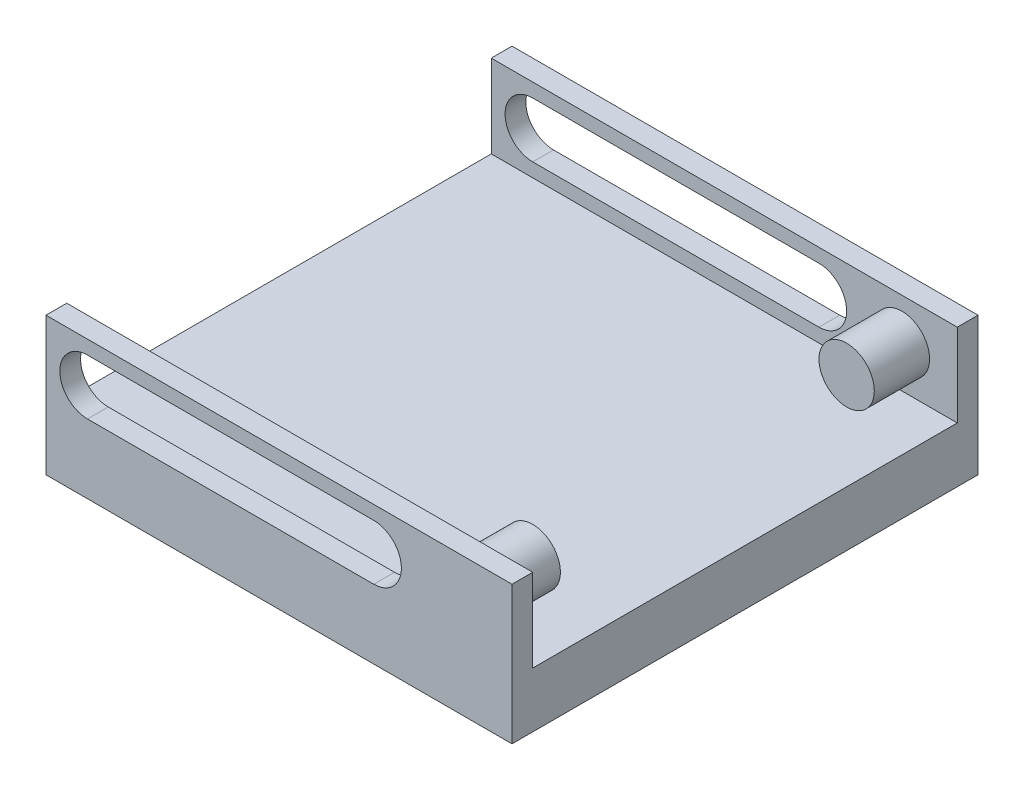
ISO-10303-21;
HEADER;
FILE_DESCRIPTION(('STEP AP214'),'2;1');
FILE_NAME('part.step','',(''),(''),'','','');
FILE_SCHEMA(('AUTOMOTIVE_DESIGN { 1 0 10303 214 1 1 1 1 }'));
ENDSEC;
DATA;
#1=APPLICATION_CONTEXT('core data for automotive mechanical design processes');
#2=APPLICATION_PROTOCOL_DEFINITION('international standard','automotive_design',2000,#1);
#3=PRODUCT_CONTEXT('',#1,'mechanical');
#4=PRODUCT('Part','Part','',(#3));
#5=PRODUCT_RELATED_PRODUCT_CATEGORY('part','',(#4));
#6=PRODUCT_DEFINITION_FORMATION('','',#4);
#7=PRODUCT_DEFINITION_CONTEXT('part definition',#1,'design');
#8=PRODUCT_DEFINITION('design','',#6,#7);
#9=PRODUCT_DEFINITION_SHAPE('','',#8);
#10=(LENGTH_UNIT() NAMED_UNIT(*) SI_UNIT(.MILLI.,.METRE.));
#11=(NAMED_UNIT(*) PLANE_ANGLE_UNIT() SI_UNIT($,.RADIAN.));
#12=(NAMED_UNIT(*) SI_UNIT($,.STERADIAN.) SOLID_ANGLE_UNIT());
#13=UNCERTAINTY_MEASURE_WITH_UNIT(LENGTH_MEASURE(1.E-05),#10,'distance_accuracy_value','');
#14=(GEOMETRIC_REPRESENTATION_CONTEXT(3) GLOBAL_UNCERTAINTY_ASSIGNED_CONTEXT((#13)) GLOBAL_UNIT_ASSIGNED_CONTEXT((#10,
#11,#12)) REPRESENTATION_CONTEXT('',''));
#15=CARTESIAN_POINT('',(0.,0.,0.));
#16=DIRECTION('',(0.,0.,1.));
#17=DIRECTION('',(1.,0.,0.));
#18=AXIS2_PLACEMENT_3D('',#15,#16,#17);
#19=CARTESIAN_POINT('',(-33.7032346991133,4.,0.));
#20=DIRECTION('',(1.,0.,0.));
#21=DIRECTION('',(0.,0.,-1.));
#22=AXIS2_PLACEMENT_3D('',#19,#20,#21);
#23=PLANE('',#22);
#24=DIRECTION('',(0.,0.,1.));
#25=VECTOR('',#24,1.);
#26=CARTESIAN_POINT('',(-33.7032346991133,0.,0.));
#27=LINE('',#26,#25);
#28=CARTESIAN_POINT('',(-33.7032346991133,0.,0.));
#29=VERTEX_POINT('',#28);
#30=CARTESIAN_POINT('',(-33.7032346991133,0.,33.7032346991133));
#31=VERTEX_POINT('',#30);
#32=EDGE_CURVE('E246',#29,#31,#27,.T.);
#33=ORIENTED_EDGE('',*,*,#32,.T.);
#34=DIRECTION('',(0.,-1.,0.));
#35=VECTOR('',#34,1.);
#36=CARTESIAN_POINT('',(-33.7032346991133,10.,33.7032346991133));
#37=LINE('',#36,#35);
#38=CARTESIAN_POINT('',(-33.7032346991133,10.,33.7032346991133));
#39=VERTEX_POINT('',#38);
#40=EDGE_CURVE('E240',#39,#31,#37,.T.);
#41=ORIENTED_EDGE('',*,*,#40,.F.);
#42=DIRECTION('',(0.,0.,1.));
#43=VECTOR('',#42,1.);
#44=CARTESIAN_POINT('',(-33.7032346991133,10.,0.));
#45=LINE('',#44,#43);
#46=CARTESIAN_POINT('',(-33.7032346991133,10.,32.2032346991133));
#47=VERTEX_POINT('',#46);
#48=EDGE_CURVE('E225',#47,#39,#45,.T.);
#49=ORIENTED_EDGE('',*,*,#48,.F.);
#50=DIRECTION('',(0.,-1.,0.));
#51=VECTOR('',#50,1.);
#52=CARTESIAN_POINT('',(-33.7032346991133,10.,32.2032346991133));
#53=LINE('',#52,#51);
#54=CARTESIAN_POINT('',(-33.7032346991133,4.,32.2032346991133));
#55=VERTEX_POINT('',#54);
#56=EDGE_CURVE('E243',#47,#55,#53,.T.);
#57=ORIENTED_EDGE('',*,*,#56,.T.);
#58=DIRECTION('',(0.,0.,1.));
#59=VECTOR('',#58,1.);
#60=CARTESIAN_POINT('',(-33.7032346991133,4.,0.));
#61=LINE('',#60,#59);
#62=CARTESIAN_POINT('',(-33.7032346991133,4.,1.5));
#63=VERTEX_POINT('',#62);
#64=EDGE_CURVE('E250',#63,#55,#61,.T.);
#65=ORIENTED_EDGE('',*,*,#64,.F.);
#66=DIRECTION('',(0.,-1.,0.));
#67=VECTOR('',#66,1.);
#68=CARTESIAN_POINT('',(-33.7032346991133,10.,1.5));
#69=LINE('',#68,#67);
#70=CARTESIAN_POINT('',(-33.7032346991133,10.,1.5));
#71=VERTEX_POINT('',#70);
#72=EDGE_CURVE('E218',#71,#63,#69,.T.);
#73=ORIENTED_EDGE('',*,*,#72,.F.);
#74=DIRECTION('',(0.,0.,1.));
#75=VECTOR('',#74,1.);
#76=CARTESIAN_POINT('',(-33.7032346991133,10.,0.));
#77=LINE('',#76,#75);
#78=CARTESIAN_POINT('',(-33.7032346991133,10.,0.));
#79=VERTEX_POINT('',#78);
#80=EDGE_CURVE('E197',#79,#71,#77,.T.);
#81=ORIENTED_EDGE('',*,*,#80,.F.);
#82=DIRECTION('',(0.,-1.,0.));
#83=VECTOR('',#82,1.);
#84=CARTESIAN_POINT('',(-33.7032346991133,10.,0.));
#85=LINE('',#84,#83);
#86=EDGE_CURVE('E207',#79,#29,#85,.T.);
#87=ORIENTED_EDGE('',*,*,#86,.T.);
#88=EDGE_LOOP('',(#33,#41,#49,#57,#65,#73,#81,#87));
#89=FACE_BOUND('',#88,.T.);
#90=ADVANCED_FACE('F38',(#89),#23,.F.);
#91=CARTESIAN_POINT('',(0.,4.,0.));
#92=DIRECTION('',(1.,0.,0.));
#93=DIRECTION('',(0.,0.,-1.));
#94=AXIS2_PLACEMENT_3D('',#91,#92,#93);
#95=PLANE('',#94);
#96=DIRECTION('',(0.,0.,1.));
#97=VECTOR('',#96,1.);
#98=CARTESIAN_POINT('',(0.,0.,0.));
#99=LINE('',#98,#97);
#100=CARTESIAN_POINT('',(0.,0.,0.));
#101=VERTEX_POINT('',#100);
#102=CARTESIAN_POINT('',(0.,0.,33.7032346991133));
#103=VERTEX_POINT('',#102);
#104=EDGE_CURVE('E251',#101,#103,#99,.T.);
#105=ORIENTED_EDGE('',*,*,#104,.F.);
#106=DIRECTION('',(0.,-1.,0.));
#107=VECTOR('',#106,1.);
#108=CARTESIAN_POINT('',(0.,10.,0.));
#109=LINE('',#108,#107);
#110=CARTESIAN_POINT('',(0.,10.,0.));
#111=VERTEX_POINT('',#110);
#112=EDGE_CURVE('E212',#111,#101,#109,.T.);
#113=ORIENTED_EDGE('',*,*,#112,.F.);
#114=DIRECTION('',(0.,0.,1.));
#115=VECTOR('',#114,1.);
#116=CARTESIAN_POINT('',(0.,10.,0.));
#117=LINE('',#116,#115);
#118=CARTESIAN_POINT('',(0.,10.,1.5));
#119=VERTEX_POINT('',#118);
#120=EDGE_CURVE('E202',#111,#119,#117,.T.);
#121=ORIENTED_EDGE('',*,*,#120,.T.);
#122=DIRECTION('',(0.,-1.,0.));
#123=VECTOR('',#122,1.);
#124=CARTESIAN_POINT('',(0.,10.,1.5));
#125=LINE('',#124,#123);
#126=CARTESIAN_POINT('',(0.,4.,1.5));
#127=VERTEX_POINT('',#126);
#128=EDGE_CURVE('E215',#119,#127,#125,.T.);
#129=ORIENTED_EDGE('',*,*,#128,.T.);
#130=DIRECTION('',(0.,0.,1.));
#131=VECTOR('',#130,1.);
#132=CARTESIAN_POINT('',(0.,4.,0.));
#133=LINE('',#132,#131);
#134=CARTESIAN_POINT('',(0.,4.,32.2032346991133));
#135=VERTEX_POINT('',#134);
#136=EDGE_CURVE('E257',#127,#135,#133,.T.);
#137=ORIENTED_EDGE('',*,*,#136,.T.);
#138=DIRECTION('',(0.,-1.,0.));
#139=VECTOR('',#138,1.);
#140=CARTESIAN_POINT('',(0.,10.,32.2032346991133));
#141=LINE('',#140,#139);
#142=CARTESIAN_POINT('',(0.,10.,32.2032346991133));
#143=VERTEX_POINT('',#142);
#144=EDGE_CURVE('E233',#143,#135,#141,.T.);
#145=ORIENTED_EDGE('',*,*,#144,.F.);
#146=DIRECTION('',(0.,0.,1.));
#147=VECTOR('',#146,1.);
#148=CARTESIAN_POINT('',(0.,10.,0.));
#149=LINE('',#148,#147);
#150=CARTESIAN_POINT('',(0.,10.,33.7032346991133));
#151=VERTEX_POINT('',#150);
#152=EDGE_CURVE('E230',#143,#151,#149,.T.);
#153=ORIENTED_EDGE('',*,*,#152,.T.);
#154=DIRECTION('',(0.,-1.,0.));
#155=VECTOR('',#154,1.);
#156=CARTESIAN_POINT('',(0.,10.,33.7032346991133));
#157=LINE('',#156,#155);
#158=EDGE_CURVE('E237',#151,#103,#157,.T.);
#159=ORIENTED_EDGE('',*,*,#158,.T.);
#160=EDGE_LOOP('',(#105,#113,#121,#129,#137,#145,#153,#159));
#161=FACE_BOUND('',#160,.T.);
#162=ADVANCED_FACE('F320',(#161),#95,.T.);
#163=CARTESIAN_POINT('',(0.,4.,0.));
#164=DIRECTION('',(0.,1.,0.));
#165=DIRECTION('',(0.,0.,1.));
#166=AXIS2_PLACEMENT_3D('',#163,#164,#165);
#167=PLANE('',#166);
#168=DIRECTION('',(1.,0.,0.));
#169=VECTOR('',#168,1.);
#170=CARTESIAN_POINT('',(0.,4.,1.5));
#171=LINE('',#170,#169);
#172=EDGE_CURVE('E247',#63,#127,#171,.T.);
#173=ORIENTED_EDGE('',*,*,#172,.F.);
#174=ORIENTED_EDGE('',*,*,#64,.T.);
#175=DIRECTION('',(1.,0.,0.));
#176=VECTOR('',#175,1.);
#177=CARTESIAN_POINT('',(0.,4.,32.2032346991133));
#178=LINE('',#177,#176);
#179=EDGE_CURVE('E254',#55,#135,#178,.T.);
#180=ORIENTED_EDGE('',*,*,#179,.T.);
#181=ORIENTED_EDGE('',*,*,#136,.F.);
#182=EDGE_LOOP('',(#173,#174,#180,#181));
#183=FACE_BOUND('',#182,.T.);
#184=ADVANCED_FACE('F325',(#183),#167,.T.);
#185=CARTESIAN_POINT('',(0.,0.,0.));
#186=DIRECTION('',(0.,1.,0.));
#187=DIRECTION('',(0.,0.,1.));
#188=AXIS2_PLACEMENT_3D('',#185,#186,#187);
#189=PLANE('',#188);
#190=ORIENTED_EDGE('',*,*,#32,.F.);
#191=DIRECTION('',(-1.,0.,0.));
#192=VECTOR('',#191,1.);
#193=CARTESIAN_POINT('',(0.,0.,0.));
#194=LINE('',#193,#192);
#195=EDGE_CURVE('E194',#101,#29,#194,.T.);
#196=ORIENTED_EDGE('',*,*,#195,.F.);
#197=ORIENTED_EDGE('',*,*,#104,.T.);
#198=DIRECTION('',(-1.,0.,0.));
#199=VECTOR('',#198,1.);
#200=CARTESIAN_POINT('',(0.,0.,33.7032346991133));
#201=LINE('',#200,#199);
#202=EDGE_CURVE('E221',#103,#31,#201,.T.);
#203=ORIENTED_EDGE('',*,*,#202,.T.);
#204=EDGE_LOOP('',(#190,#196,#197,#203));
#205=FACE_BOUND('',#204,.T.);
#206=ADVANCED_FACE('F337',(#205),#189,.F.);
#207=CARTESIAN_POINT('',(0.,10.,32.2032346991133));
#208=DIRECTION('',(0.,0.,-1.));
#209=DIRECTION('',(-1.,0.,0.));
#210=AXIS2_PLACEMENT_3D('',#207,#208,#209);
#211=PLANE('',#210);
#212=CARTESIAN_POINT('',(-10.,6.99999999999999,32.2032346991133));
#213=DIRECTION('',(0.,0.,-1.));
#214=DIRECTION('',(-1.,0.,0.));
#215=AXIS2_PLACEMENT_3D('',#212,#213,#214);
#216=CIRCLE('',#215,2.);
#217=CARTESIAN_POINT('',(-10.,9.,32.2032346991133));
#218=VERTEX_POINT('',#217);
#219=CARTESIAN_POINT('',(-10.,4.99999999999999,32.2032346991133));
#220=VERTEX_POINT('',#219);
#221=EDGE_CURVE('E185',#218,#220,#216,.T.);
#222=ORIENTED_EDGE('',*,*,#221,.F.);
#223=DIRECTION('',(1.,0.,0.));
#224=VECTOR('',#223,1.);
#225=CARTESIAN_POINT('',(0.,9.,32.2032346991133));
#226=LINE('',#225,#224);
#227=CARTESIAN_POINT('',(-30.7032346991133,9.,32.2032346991133));
#228=VERTEX_POINT('',#227);
#229=EDGE_CURVE('E169',#228,#218,#226,.T.);
#230=ORIENTED_EDGE('',*,*,#229,.F.);
#231=CARTESIAN_POINT('',(-30.7032346991133,7.,32.2032346991133));
#232=DIRECTION('',(0.,0.,-1.));
#233=DIRECTION('',(-1.,0.,0.));
#234=AXIS2_PLACEMENT_3D('',#231,#232,#233);
#235=CIRCLE('',#234,2.);
#236=CARTESIAN_POINT('',(-30.7032346991133,5.,32.2032346991133));
#237=VERTEX_POINT('',#236);
#238=EDGE_CURVE('E158',#237,#228,#235,.T.);
#239=ORIENTED_EDGE('',*,*,#238,.F.);
#240=DIRECTION('',(1.,0.,0.));
#241=VECTOR('',#240,1.);
#242=CARTESIAN_POINT('',(0.,4.99999999999999,32.2032346991133));
#243=LINE('',#242,#241);
#244=EDGE_CURVE('E147',#237,#220,#243,.T.);
#245=ORIENTED_EDGE('',*,*,#244,.T.);
#246=EDGE_LOOP('',(#222,#230,#239,#245));
#247=FACE_BOUND('',#246,.T.);
#248=CARTESIAN_POINT('',(-3.99999999999999,7.,32.2032346991133));
#249=DIRECTION('',(0.,0.,-1.));
#250=DIRECTION('',(-1.,0.,0.));
#251=AXIS2_PLACEMENT_3D('',#248,#249,#250);
#252=CIRCLE('',#251,2.);
#253=CARTESIAN_POINT('',(-5.99999999999999,7.,32.2032346991133));
#254=VERTEX_POINT('',#253);
#255=EDGE_CURVE('E190',#254,#254,#252,.T.);
#256=ORIENTED_EDGE('',*,*,#255,.F.);
#257=EDGE_LOOP('',(#256));
#258=FACE_BOUND('',#257,.T.);
#259=ORIENTED_EDGE('',*,*,#179,.F.);
#260=ORIENTED_EDGE('',*,*,#56,.F.);
#261=DIRECTION('',(1.,0.,0.));
#262=VECTOR('',#261,1.);
#263=CARTESIAN_POINT('',(0.,10.,32.2032346991133));
#264=LINE('',#263,#262);
#265=EDGE_CURVE('E222',#47,#143,#264,.T.);
#266=ORIENTED_EDGE('',*,*,#265,.T.);
#267=ORIENTED_EDGE('',*,*,#144,.T.);
#268=EDGE_LOOP('',(#259,#260,#266,#267));
#269=FACE_BOUND('',#268,.T.);
#270=ADVANCED_FACE('F167',(#247,#258,#269),#211,.T.);
#271=CARTESIAN_POINT('',(0.,10.,33.7032346991133));
#272=DIRECTION('',(0.,0.,1.));
#273=DIRECTION('',(1.,0.,0.));
#274=AXIS2_PLACEMENT_3D('',#271,#272,#273);
#275=PLANE('',#274);
#276=CARTESIAN_POINT('',(-10.,6.99999999999999,33.7032346991133));
#277=DIRECTION('',(0.,0.,1.));
#278=DIRECTION('',(1.,0.,0.));
#279=AXIS2_PLACEMENT_3D('',#276,#277,#278);
#280=CIRCLE('',#279,2.);
#281=CARTESIAN_POINT('',(-10.,4.99999999999999,33.7032346991133));
#282=VERTEX_POINT('',#281);
#283=CARTESIAN_POINT('',(-10.,9.,33.7032346991133));
#284=VERTEX_POINT('',#283);
#285=EDGE_CURVE('E183',#282,#284,#280,.T.);
#286=ORIENTED_EDGE('',*,*,#285,.F.);
#287=DIRECTION('',(-1.,0.,0.));
#288=VECTOR('',#287,1.);
#289=CARTESIAN_POINT('',(0.,4.99999999999999,33.7032346991133));
#290=LINE('',#289,#288);
#291=CARTESIAN_POINT('',(-30.7032346991133,5.,33.7032346991133));
#292=VERTEX_POINT('',#291);
#293=EDGE_CURVE('E153',#282,#292,#290,.T.);
#294=ORIENTED_EDGE('',*,*,#293,.T.);
#295=CARTESIAN_POINT('',(-30.7032346991133,7.,33.7032346991133));
#296=DIRECTION('',(0.,0.,1.));
#297=DIRECTION('',(1.,0.,0.));
#298=AXIS2_PLACEMENT_3D('',#295,#296,#297);
#299=CIRCLE('',#298,2.);
#300=CARTESIAN_POINT('',(-30.7032346991133,9.,33.7032346991133));
#301=VERTEX_POINT('',#300);
#302=EDGE_CURVE('E161',#301,#292,#299,.T.);
#303=ORIENTED_EDGE('',*,*,#302,.F.);
#304=DIRECTION('',(-1.,0.,0.));
#305=VECTOR('',#304,1.);
#306=CARTESIAN_POINT('',(0.,9.,33.7032346991133));
#307=LINE('',#306,#305);
#308=EDGE_CURVE('E173',#284,#301,#307,.T.);
#309=ORIENTED_EDGE('',*,*,#308,.F.);
#310=EDGE_LOOP('',(#286,#294,#303,#309));
#311=FACE_BOUND('',#310,.T.);
#312=ORIENTED_EDGE('',*,*,#202,.F.);
#313=ORIENTED_EDGE('',*,*,#158,.F.);
#314=DIRECTION('',(-1.,0.,0.));
#315=VECTOR('',#314,1.);
#316=CARTESIAN_POINT('',(0.,10.,33.7032346991133));
#317=LINE('',#316,#315);
#318=EDGE_CURVE('E227',#151,#39,#317,.T.);
#319=ORIENTED_EDGE('',*,*,#318,.T.);
#320=ORIENTED_EDGE('',*,*,#40,.T.);
#321=EDGE_LOOP('',(#312,#313,#319,#320));
#322=FACE_BOUND('',#321,.T.);
#323=ADVANCED_FACE('F335',(#311,#322),#275,.T.);
#324=CARTESIAN_POINT('',(0.,10.,0.));
#325=DIRECTION('',(0.,1.,0.));
#326=DIRECTION('',(0.,0.,1.));
#327=AXIS2_PLACEMENT_3D('',#324,#325,#326);
#328=PLANE('',#327);
#329=ORIENTED_EDGE('',*,*,#265,.F.);
#330=ORIENTED_EDGE('',*,*,#48,.T.);
#331=ORIENTED_EDGE('',*,*,#318,.F.);
#332=ORIENTED_EDGE('',*,*,#152,.F.);
#333=EDGE_LOOP('',(#329,#330,#331,#332));
#334=FACE_BOUND('',#333,.T.);
#335=ADVANCED_FACE('F341',(#334),#328,.T.);
#336=CARTESIAN_POINT('',(0.,10.,1.5));
#337=DIRECTION('',(0.,0.,-1.));
#338=DIRECTION('',(-1.,0.,0.));
#339=AXIS2_PLACEMENT_3D('',#336,#337,#338);
#340=PLANE('',#339);
#341=DIRECTION('',(1.,0.,0.));
#342=VECTOR('',#341,1.);
#343=CARTESIAN_POINT('',(0.,9.,1.5));
#344=LINE('',#343,#342);
#345=CARTESIAN_POINT('',(-30.7032346991133,9.,1.5));
#346=VERTEX_POINT('',#345);
#347=CARTESIAN_POINT('',(-10.,9.,1.5));
#348=VERTEX_POINT('',#347);
#349=EDGE_CURVE('E170',#346,#348,#344,.T.);
#350=ORIENTED_EDGE('',*,*,#349,.T.);
#351=CARTESIAN_POINT('',(-10.,6.99999999999999,1.5));
#352=DIRECTION('',(0.,0.,-1.));
#353=DIRECTION('',(-1.,0.,0.));
#354=AXIS2_PLACEMENT_3D('',#351,#352,#353);
#355=CIRCLE('',#354,2.);
#356=CARTESIAN_POINT('',(-10.,4.99999999999999,1.5));
#357=VERTEX_POINT('',#356);
#358=EDGE_CURVE('E180',#348,#357,#355,.T.);
#359=ORIENTED_EDGE('',*,*,#358,.T.);
#360=DIRECTION('',(1.,0.,0.));
#361=VECTOR('',#360,1.);
#362=CARTESIAN_POINT('',(0.,4.99999999999999,1.5));
#363=LINE('',#362,#361);
#364=CARTESIAN_POINT('',(-30.7032346991133,5.,1.5));
#365=VERTEX_POINT('',#364);
#366=EDGE_CURVE('E289',#365,#357,#363,.T.);
#367=ORIENTED_EDGE('',*,*,#366,.F.);
#368=CARTESIAN_POINT('',(-30.7032346991133,7.,1.5));
#369=DIRECTION('',(0.,0.,-1.));
#370=DIRECTION('',(-1.,0.,0.));
#371=AXIS2_PLACEMENT_3D('',#368,#369,#370);
#372=CIRCLE('',#371,2.);
#373=EDGE_CURVE('E152',#365,#346,#372,.T.);
#374=ORIENTED_EDGE('',*,*,#373,.T.);
#375=EDGE_LOOP('',(#350,#359,#367,#374));
#376=FACE_BOUND('',#375,.T.);
#377=CARTESIAN_POINT('',(-4.,7.,1.5));
#378=DIRECTION('',(0.,0.,-1.));
#379=DIRECTION('',(-1.,0.,0.));
#380=AXIS2_PLACEMENT_3D('',#377,#378,#379);
#381=CIRCLE('',#380,2.);
#382=CARTESIAN_POINT('',(-6.,7.,1.5));
#383=VERTEX_POINT('',#382);
#384=EDGE_CURVE('E260',#383,#383,#381,.F.);
#385=ORIENTED_EDGE('',*,*,#384,.F.);
#386=EDGE_LOOP('',(#385));
#387=FACE_BOUND('',#386,.T.);
#388=ORIENTED_EDGE('',*,*,#72,.T.);
#389=ORIENTED_EDGE('',*,*,#172,.T.);
#390=ORIENTED_EDGE('',*,*,#128,.F.);
#391=DIRECTION('',(1.,0.,0.));
#392=VECTOR('',#391,1.);
#393=CARTESIAN_POINT('',(0.,10.,1.5));
#394=LINE('',#393,#392);
#395=EDGE_CURVE('E200',#71,#119,#394,.T.);
#396=ORIENTED_EDGE('',*,*,#395,.F.);
#397=EDGE_LOOP('',(#388,#389,#390,#396));
#398=FACE_BOUND('',#397,.T.);
#399=ADVANCED_FACE('F300',(#376,#387,#398),#340,.F.);
#400=CARTESIAN_POINT('',(0.,10.,0.));
#401=DIRECTION('',(0.,0.,1.));
#402=DIRECTION('',(1.,0.,0.));
#403=AXIS2_PLACEMENT_3D('',#400,#401,#402);
#404=PLANE('',#403);
#405=DIRECTION('',(-1.,0.,0.));
#406=VECTOR('',#405,1.);
#407=CARTESIAN_POINT('',(0.,4.99999999999999,0.));
#408=LINE('',#407,#406);
#409=CARTESIAN_POINT('',(-10.,4.99999999999999,0.));
#410=VERTEX_POINT('',#409);
#411=CARTESIAN_POINT('',(-30.7032346991133,5.,0.));
#412=VERTEX_POINT('',#411);
#413=EDGE_CURVE('E265',#410,#412,#408,.T.);
#414=ORIENTED_EDGE('',*,*,#413,.F.);
#415=CARTESIAN_POINT('',(-10.,6.99999999999999,0.));
#416=DIRECTION('',(0.,0.,1.));
#417=DIRECTION('',(1.,0.,0.));
#418=AXIS2_PLACEMENT_3D('',#415,#416,#417);
#419=CIRCLE('',#418,2.);
#420=CARTESIAN_POINT('',(-10.,9.,0.));
#421=VERTEX_POINT('',#420);
#422=EDGE_CURVE('E11',#410,#421,#419,.T.);
#423=ORIENTED_EDGE('',*,*,#422,.T.);
#424=DIRECTION('',(-1.,0.,0.));
#425=VECTOR('',#424,1.);
#426=CARTESIAN_POINT('',(0.,9.,0.));
#427=LINE('',#426,#425);
#428=CARTESIAN_POINT('',(-30.7032346991133,9.,0.));
#429=VERTEX_POINT('',#428);
#430=EDGE_CURVE('E45',#421,#429,#427,.T.);
#431=ORIENTED_EDGE('',*,*,#430,.T.);
#432=CARTESIAN_POINT('',(-30.7032346991133,7.,0.));
#433=DIRECTION('',(0.,0.,1.));
#434=DIRECTION('',(1.,0.,0.));
#435=AXIS2_PLACEMENT_3D('',#432,#433,#434);
#436=CIRCLE('',#435,2.);
#437=EDGE_CURVE('E267',#429,#412,#436,.T.);
#438=ORIENTED_EDGE('',*,*,#437,.T.);
#439=EDGE_LOOP('',(#414,#423,#431,#438));
#440=FACE_BOUND('',#439,.T.);
#441=ORIENTED_EDGE('',*,*,#195,.T.);
#442=ORIENTED_EDGE('',*,*,#86,.F.);
#443=DIRECTION('',(-1.,0.,0.));
#444=VECTOR('',#443,1.);
#445=CARTESIAN_POINT('',(0.,10.,0.));
#446=LINE('',#445,#444);
#447=EDGE_CURVE('E205',#111,#79,#446,.T.);
#448=ORIENTED_EDGE('',*,*,#447,.F.);
#449=ORIENTED_EDGE('',*,*,#112,.T.);
#450=EDGE_LOOP('',(#441,#442,#448,#449));
#451=FACE_BOUND('',#450,.T.);
#452=ADVANCED_FACE('F272',(#440,#451),#404,.F.);
#453=CARTESIAN_POINT('',(0.,10.,0.));
#454=DIRECTION('',(0.,1.,0.));
#455=DIRECTION('',(0.,0.,1.));
#456=AXIS2_PLACEMENT_3D('',#453,#454,#455);
#457=PLANE('',#456);
#458=ORIENTED_EDGE('',*,*,#80,.T.);
#459=ORIENTED_EDGE('',*,*,#395,.T.);
#460=ORIENTED_EDGE('',*,*,#120,.F.);
#461=ORIENTED_EDGE('',*,*,#447,.T.);
#462=EDGE_LOOP('',(#458,#459,#460,#461));
#463=FACE_BOUND('',#462,.T.);
#464=ADVANCED_FACE('F349',(#463),#457,.T.);
#465=CARTESIAN_POINT('',(-3.99999999999999,7.,28.2032346991133));
#466=DIRECTION('',(0.,0.,1.));
#467=DIRECTION('',(1.,0.,0.));
#468=AXIS2_PLACEMENT_3D('',#465,#466,#467);
#469=CYLINDRICAL_SURFACE('',#468,2.);
#470=CARTESIAN_POINT('',(-3.99999999999999,7.,28.2032346991133));
#471=DIRECTION('',(0.,0.,-1.));
#472=DIRECTION('',(-1.,0.,0.));
#473=AXIS2_PLACEMENT_3D('',#470,#471,#472);
#474=CIRCLE('',#473,2.);
#475=CARTESIAN_POINT('',(-5.99999999999999,7.,28.2032346991133));
#476=VERTEX_POINT('',#475);
#477=EDGE_CURVE('E191',#476,#476,#474,.T.);
#478=ORIENTED_EDGE('',*,*,#477,.F.);
#479=EDGE_LOOP('',(#478));
#480=FACE_BOUND('',#479,.T.);
#481=ORIENTED_EDGE('',*,*,#255,.T.);
#482=EDGE_LOOP('',(#481));
#483=FACE_BOUND('',#482,.T.);
#484=ADVANCED_FACE('F393',(#480,#483),#469,.T.);
#485=CARTESIAN_POINT('',(0.,0.,28.2032346991133));
#486=DIRECTION('',(0.,0.,-1.));
#487=DIRECTION('',(-1.,0.,0.));
#488=AXIS2_PLACEMENT_3D('',#485,#486,#487);
#489=PLANE('',#488);
#490=ORIENTED_EDGE('',*,*,#477,.T.);
#491=EDGE_LOOP('',(#490));
#492=FACE_BOUND('',#491,.T.);
#493=ADVANCED_FACE('F404',(#492),#489,.T.);
#494=CARTESIAN_POINT('',(-4.,7.,5.5));
#495=DIRECTION('',(0.,0.,-1.));
#496=DIRECTION('',(-1.,0.,0.));
#497=AXIS2_PLACEMENT_3D('',#494,#495,#496);
#498=CYLINDRICAL_SURFACE('',#497,2.);
#499=CARTESIAN_POINT('',(-4.,7.,5.5));
#500=DIRECTION('',(0.,0.,1.));
#501=DIRECTION('',(1.,0.,0.));
#502=AXIS2_PLACEMENT_3D('',#499,#500,#501);
#503=CIRCLE('',#502,2.);
#504=CARTESIAN_POINT('',(-2.,7.,5.5));
#505=VERTEX_POINT('',#504);
#506=EDGE_CURVE('E187',#505,#505,#503,.T.);
#507=ORIENTED_EDGE('',*,*,#506,.F.);
#508=EDGE_LOOP('',(#507));
#509=FACE_BOUND('',#508,.T.);
#510=ORIENTED_EDGE('',*,*,#384,.T.);
#511=EDGE_LOOP('',(#510));
#512=FACE_BOUND('',#511,.T.);
#513=ADVANCED_FACE('F314',(#509,#512),#498,.T.);
#514=CARTESIAN_POINT('',(-4.,7.,5.5));
#515=DIRECTION('',(0.,0.,1.));
#516=DIRECTION('',(1.,0.,0.));
#517=AXIS2_PLACEMENT_3D('',#514,#515,#516);
#518=PLANE('',#517);
#519=ORIENTED_EDGE('',*,*,#506,.T.);
#520=EDGE_LOOP('',(#519));
#521=FACE_BOUND('',#520,.T.);
#522=ADVANCED_FACE('F307',(#521),#518,.T.);
#523=CARTESIAN_POINT('',(0.,4.99999999999999,42.2032346991133));
#524=DIRECTION('',(0.,1.,0.));
#525=DIRECTION('',(-1.,0.,0.));
#526=AXIS2_PLACEMENT_3D('',#523,#524,#525);
#527=PLANE('',#526);
#528=ORIENTED_EDGE('',*,*,#366,.T.);
#529=DIRECTION('',(0.,0.,-1.));
#530=VECTOR('',#529,1.);
#531=CARTESIAN_POINT('',(-10.,4.99999999999999,42.2032346991133));
#532=LINE('',#531,#530);
#533=EDGE_CURVE('E293',#357,#410,#532,.T.);
#534=ORIENTED_EDGE('',*,*,#533,.T.);
#535=ORIENTED_EDGE('',*,*,#413,.T.);
#536=DIRECTION('',(0.,0.,-1.));
#537=VECTOR('',#536,1.);
#538=CARTESIAN_POINT('',(-30.7032346991133,5.,42.2032346991133));
#539=LINE('',#538,#537);
#540=EDGE_CURVE('E164',#365,#412,#539,.T.);
#541=ORIENTED_EDGE('',*,*,#540,.F.);
#542=EDGE_LOOP('',(#528,#534,#535,#541));
#543=FACE_BOUND('',#542,.T.);
#544=ADVANCED_FACE('F305',(#543),#527,.T.);
#545=CARTESIAN_POINT('',(-30.7032346991133,7.,42.2032346991133));
#546=DIRECTION('',(0.,0.,-1.));
#547=DIRECTION('',(-1.,0.,0.));
#548=AXIS2_PLACEMENT_3D('',#545,#546,#547);
#549=CYLINDRICAL_SURFACE('',#548,2.);
#550=ORIENTED_EDGE('',*,*,#540,.T.);
#551=ORIENTED_EDGE('',*,*,#437,.F.);
#552=DIRECTION('',(0.,0.,-1.));
#553=VECTOR('',#552,1.);
#554=CARTESIAN_POINT('',(-30.7032346991133,9.,42.2032346991133));
#555=LINE('',#554,#553);
#556=EDGE_CURVE('E163',#346,#429,#555,.T.);
#557=ORIENTED_EDGE('',*,*,#556,.F.);
#558=ORIENTED_EDGE('',*,*,#373,.F.);
#559=EDGE_LOOP('',(#550,#551,#557,#558));
#560=FACE_BOUND('',#559,.T.);
#561=ADVANCED_FACE('F303',(#560),#549,.F.);
#562=CARTESIAN_POINT('',(0.,9.,42.2032346991133));
#563=DIRECTION('',(0.,1.,0.));
#564=DIRECTION('',(-1.,0.,0.));
#565=AXIS2_PLACEMENT_3D('',#562,#563,#564);
#566=PLANE('',#565);
#567=ORIENTED_EDGE('',*,*,#556,.T.);
#568=ORIENTED_EDGE('',*,*,#430,.F.);
#569=DIRECTION('',(0.,0.,-1.));
#570=VECTOR('',#569,1.);
#571=CARTESIAN_POINT('',(-10.,9.,42.2032346991133));
#572=LINE('',#571,#570);
#573=EDGE_CURVE('E280',#348,#421,#572,.T.);
#574=ORIENTED_EDGE('',*,*,#573,.F.);
#575=ORIENTED_EDGE('',*,*,#349,.F.);
#576=EDGE_LOOP('',(#567,#568,#574,#575));
#577=FACE_BOUND('',#576,.T.);
#578=ADVANCED_FACE('F279',(#577),#566,.F.);
#579=CARTESIAN_POINT('',(-10.,6.99999999999999,42.2032346991133));
#580=DIRECTION('',(0.,0.,-1.));
#581=DIRECTION('',(-1.,0.,0.));
#582=AXIS2_PLACEMENT_3D('',#579,#580,#581);
#583=CYLINDRICAL_SURFACE('',#582,2.);
#584=ORIENTED_EDGE('',*,*,#573,.T.);
#585=ORIENTED_EDGE('',*,*,#422,.F.);
#586=ORIENTED_EDGE('',*,*,#533,.F.);
#587=ORIENTED_EDGE('',*,*,#358,.F.);
#588=EDGE_LOOP('',(#584,#585,#586,#587));
#589=FACE_BOUND('',#588,.T.);
#590=ADVANCED_FACE('F283',(#589),#583,.F.);
#591=ORIENTED_EDGE('',*,*,#221,.T.);
#592=EDGE_CURVE('E52',#282,#220,#532,.T.);
#593=ORIENTED_EDGE('',*,*,#592,.F.);
#594=ORIENTED_EDGE('',*,*,#285,.T.);
#595=EDGE_CURVE('E285',#284,#218,#572,.T.);
#596=ORIENTED_EDGE('',*,*,#595,.T.);
#597=EDGE_LOOP('',(#591,#593,#594,#596));
#598=FACE_BOUND('',#597,.T.);
#599=ADVANCED_FACE('F478',(#598),#583,.F.);
#600=ORIENTED_EDGE('',*,*,#229,.T.);
#601=ORIENTED_EDGE('',*,*,#595,.F.);
#602=ORIENTED_EDGE('',*,*,#308,.T.);
#603=EDGE_CURVE('E286',#301,#228,#555,.T.);
#604=ORIENTED_EDGE('',*,*,#603,.T.);
#605=EDGE_LOOP('',(#600,#601,#602,#604));
#606=FACE_BOUND('',#605,.T.);
#607=ADVANCED_FACE('F470',(#606),#566,.F.);
#608=ORIENTED_EDGE('',*,*,#238,.T.);
#609=ORIENTED_EDGE('',*,*,#603,.F.);
#610=ORIENTED_EDGE('',*,*,#302,.T.);
#611=EDGE_CURVE('E57',#292,#237,#539,.T.);
#612=ORIENTED_EDGE('',*,*,#611,.T.);
#613=EDGE_LOOP('',(#608,#609,#610,#612));
#614=FACE_BOUND('',#613,.T.);
#615=ADVANCED_FACE('F156',(#614),#549,.F.);
#616=ORIENTED_EDGE('',*,*,#611,.F.);
#617=ORIENTED_EDGE('',*,*,#293,.F.);
#618=ORIENTED_EDGE('',*,*,#592,.T.);
#619=ORIENTED_EDGE('',*,*,#244,.F.);
#620=EDGE_LOOP('',(#616,#617,#618,#619));
#621=FACE_BOUND('',#620,.T.);
#622=ADVANCED_FACE('F148',(#621),#527,.T.);
#623=CLOSED_SHELL('',(#90,#162,#184,#206,#270,#323,#335,#399,#452,#464,#484,#493,#513,#522,#544,
#561,#578,#590,#599,#607,#615,#622));
#624=MANIFOLD_SOLID_BREP('B2',#623);
#625=ADVANCED_BREP_SHAPE_REPRESENTATION('',(#18,#624),#14);
#626=SHAPE_DEFINITION_REPRESENTATION(#9,#625);
ENDSEC;
END-ISO-10303-21;
